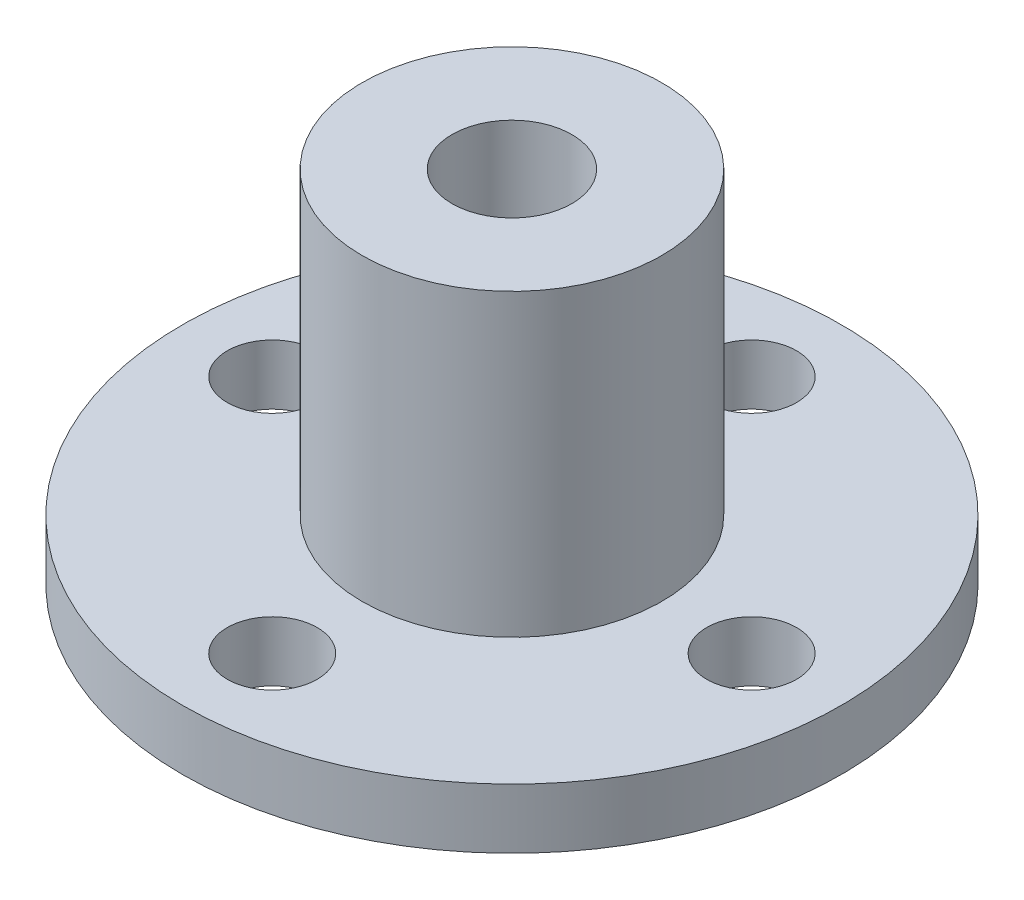
ISO-10303-21;
HEADER;
FILE_DESCRIPTION(('STEP AP214'),'2;1');
FILE_NAME('part.step','',(''),(''),'','','');
FILE_SCHEMA(('AUTOMOTIVE_DESIGN { 1 0 10303 214 1 1 1 1 }'));
ENDSEC;
DATA;
#1=APPLICATION_CONTEXT('core data for automotive mechanical design processes');
#2=APPLICATION_PROTOCOL_DEFINITION('international standard','automotive_design',2000,#1);
#3=PRODUCT_CONTEXT('',#1,'mechanical');
#4=PRODUCT('Part','Part','',(#3));
#5=PRODUCT_RELATED_PRODUCT_CATEGORY('part','',(#4));
#6=PRODUCT_DEFINITION_FORMATION('','',#4);
#7=PRODUCT_DEFINITION_CONTEXT('part definition',#1,'design');
#8=PRODUCT_DEFINITION('design','',#6,#7);
#9=PRODUCT_DEFINITION_SHAPE('','',#8);
#10=(LENGTH_UNIT() NAMED_UNIT(*) SI_UNIT(.MILLI.,.METRE.));
#11=(NAMED_UNIT(*) PLANE_ANGLE_UNIT() SI_UNIT($,.RADIAN.));
#12=(NAMED_UNIT(*) SI_UNIT($,.STERADIAN.) SOLID_ANGLE_UNIT());
#13=UNCERTAINTY_MEASURE_WITH_UNIT(LENGTH_MEASURE(1.E-05),#10,'distance_accuracy_value','');
#14=(GEOMETRIC_REPRESENTATION_CONTEXT(3) GLOBAL_UNCERTAINTY_ASSIGNED_CONTEXT((#13)) GLOBAL_UNIT_ASSIGNED_CONTEXT((#10,
#11,#12)) REPRESENTATION_CONTEXT('',''));
#15=CARTESIAN_POINT('',(0.,0.,0.));
#16=DIRECTION('',(0.,0.,1.));
#17=DIRECTION('',(1.,0.,0.));
#18=AXIS2_PLACEMENT_3D('',#15,#16,#17);
#19=CARTESIAN_POINT('',(0.,2.,0.));
#20=DIRECTION('',(0.,-1.,0.));
#21=DIRECTION('',(0.,0.,-1.));
#22=AXIS2_PLACEMENT_3D('',#19,#20,#21);
#23=CYLINDRICAL_SURFACE('',#22,11.);
#24=CARTESIAN_POINT('',(0.,2.,0.));
#25=DIRECTION('',(0.,1.,0.));
#26=DIRECTION('',(0.,0.,1.));
#27=AXIS2_PLACEMENT_3D('',#24,#25,#26);
#28=CIRCLE('',#27,11.);
#29=CARTESIAN_POINT('',(0.,2.,11.));
#30=VERTEX_POINT('',#29);
#31=EDGE_CURVE('E48',#30,#30,#28,.T.);
#32=ORIENTED_EDGE('',*,*,#31,.F.);
#33=EDGE_LOOP('',(#32));
#34=FACE_BOUND('',#33,.T.);
#35=CARTESIAN_POINT('',(0.,0.,0.));
#36=DIRECTION('',(0.,1.,0.));
#37=DIRECTION('',(0.,0.,1.));
#38=AXIS2_PLACEMENT_3D('',#35,#36,#37);
#39=CIRCLE('',#38,11.);
#40=CARTESIAN_POINT('',(0.,0.,11.));
#41=VERTEX_POINT('',#40);
#42=EDGE_CURVE('E44',#41,#41,#39,.T.);
#43=ORIENTED_EDGE('',*,*,#42,.T.);
#44=EDGE_LOOP('',(#43));
#45=FACE_BOUND('',#44,.T.);
#46=ADVANCED_FACE('F41',(#34,#45),#23,.T.);
#47=CARTESIAN_POINT('',(0.,2.,0.));
#48=DIRECTION('',(0.,1.,0.));
#49=DIRECTION('',(0.,0.,1.));
#50=AXIS2_PLACEMENT_3D('',#47,#48,#49);
#51=PLANE('',#50);
#52=CARTESIAN_POINT('',(0.,2.,-8.));
#53=DIRECTION('',(0.,1.,0.));
#54=DIRECTION('',(-1.,0.,0.));
#55=AXIS2_PLACEMENT_3D('',#52,#53,#54);
#56=CIRCLE('',#55,1.5);
#57=CARTESIAN_POINT('',(-1.49999999999997,2.,-8.00000000000001));
#58=VERTEX_POINT('',#57);
#59=EDGE_CURVE('E82',#58,#58,#56,.T.);
#60=ORIENTED_EDGE('',*,*,#59,.F.);
#61=EDGE_LOOP('',(#60));
#62=FACE_BOUND('',#61,.T.);
#63=CARTESIAN_POINT('',(8.,2.,0.));
#64=DIRECTION('',(0.,1.,0.));
#65=DIRECTION('',(0.,0.,-1.));
#66=AXIS2_PLACEMENT_3D('',#63,#64,#65);
#67=CIRCLE('',#66,1.5);
#68=CARTESIAN_POINT('',(8.,2.,-1.5));
#69=VERTEX_POINT('',#68);
#70=EDGE_CURVE('E76',#69,#69,#67,.T.);
#71=ORIENTED_EDGE('',*,*,#70,.F.);
#72=EDGE_LOOP('',(#71));
#73=FACE_BOUND('',#72,.T.);
#74=CARTESIAN_POINT('',(0.,2.,8.));
#75=DIRECTION('',(0.,1.,0.));
#76=DIRECTION('',(1.,0.,0.));
#77=AXIS2_PLACEMENT_3D('',#74,#75,#76);
#78=CIRCLE('',#77,1.5);
#79=CARTESIAN_POINT('',(1.49999999999992,2.,8.00000000000002));
#80=VERTEX_POINT('',#79);
#81=EDGE_CURVE('E70',#80,#80,#78,.T.);
#82=ORIENTED_EDGE('',*,*,#81,.F.);
#83=EDGE_LOOP('',(#82));
#84=FACE_BOUND('',#83,.T.);
#85=CARTESIAN_POINT('',(-8.,2.,0.));
#86=DIRECTION('',(0.,1.,0.));
#87=DIRECTION('',(0.,0.,1.));
#88=AXIS2_PLACEMENT_3D('',#85,#86,#87);
#89=CIRCLE('',#88,1.5);
#90=CARTESIAN_POINT('',(-8.,2.,1.5));
#91=VERTEX_POINT('',#90);
#92=EDGE_CURVE('E64',#91,#91,#89,.T.);
#93=ORIENTED_EDGE('',*,*,#92,.F.);
#94=EDGE_LOOP('',(#93));
#95=FACE_BOUND('',#94,.T.);
#96=CARTESIAN_POINT('',(0.,2.,0.));
#97=DIRECTION('',(0.,1.,0.));
#98=DIRECTION('',(0.,0.,1.));
#99=AXIS2_PLACEMENT_3D('',#96,#97,#98);
#100=CIRCLE('',#99,5.);
#101=CARTESIAN_POINT('',(0.,2.,5.));
#102=VERTEX_POINT('',#101);
#103=EDGE_CURVE('E10',#102,#102,#100,.T.);
#104=ORIENTED_EDGE('',*,*,#103,.F.);
#105=EDGE_LOOP('',(#104));
#106=FACE_BOUND('',#105,.T.);
#107=ORIENTED_EDGE('',*,*,#31,.T.);
#108=EDGE_LOOP('',(#107));
#109=FACE_BOUND('',#108,.T.);
#110=ADVANCED_FACE('F98',(#62,#73,#84,#95,#106,#109),#51,.T.);
#111=CARTESIAN_POINT('',(0.,0.,0.));
#112=DIRECTION('',(0.,1.,0.));
#113=DIRECTION('',(0.,0.,1.));
#114=AXIS2_PLACEMENT_3D('',#111,#112,#113);
#115=PLANE('',#114);
#116=CARTESIAN_POINT('',(0.,0.,-8.));
#117=DIRECTION('',(0.,1.,0.));
#118=DIRECTION('',(-1.,0.,0.));
#119=AXIS2_PLACEMENT_3D('',#116,#117,#118);
#120=CIRCLE('',#119,1.5);
#121=CARTESIAN_POINT('',(-1.49999999999997,0.,-8.00000000000001));
#122=VERTEX_POINT('',#121);
#123=EDGE_CURVE('E67',#122,#122,#120,.T.);
#124=ORIENTED_EDGE('',*,*,#123,.T.);
#125=EDGE_LOOP('',(#124));
#126=FACE_BOUND('',#125,.T.);
#127=CARTESIAN_POINT('',(8.,0.,0.));
#128=DIRECTION('',(0.,1.,0.));
#129=DIRECTION('',(0.,0.,-1.));
#130=AXIS2_PLACEMENT_3D('',#127,#128,#129);
#131=CIRCLE('',#130,1.5);
#132=CARTESIAN_POINT('',(8.,0.,-1.5));
#133=VERTEX_POINT('',#132);
#134=EDGE_CURVE('E79',#133,#133,#131,.T.);
#135=ORIENTED_EDGE('',*,*,#134,.T.);
#136=EDGE_LOOP('',(#135));
#137=FACE_BOUND('',#136,.T.);
#138=CARTESIAN_POINT('',(0.,0.,8.));
#139=DIRECTION('',(0.,1.,0.));
#140=DIRECTION('',(1.,0.,0.));
#141=AXIS2_PLACEMENT_3D('',#138,#139,#140);
#142=CIRCLE('',#141,1.5);
#143=CARTESIAN_POINT('',(1.49999999999992,0.,8.00000000000002));
#144=VERTEX_POINT('',#143);
#145=EDGE_CURVE('E73',#144,#144,#142,.T.);
#146=ORIENTED_EDGE('',*,*,#145,.T.);
#147=EDGE_LOOP('',(#146));
#148=FACE_BOUND('',#147,.T.);
#149=CARTESIAN_POINT('',(-8.,0.,0.));
#150=DIRECTION('',(0.,1.,0.));
#151=DIRECTION('',(0.,0.,1.));
#152=AXIS2_PLACEMENT_3D('',#149,#150,#151);
#153=CIRCLE('',#152,1.5);
#154=CARTESIAN_POINT('',(-8.,0.,1.5));
#155=VERTEX_POINT('',#154);
#156=EDGE_CURVE('E61',#155,#155,#153,.T.);
#157=ORIENTED_EDGE('',*,*,#156,.T.);
#158=EDGE_LOOP('',(#157));
#159=FACE_BOUND('',#158,.T.);
#160=CARTESIAN_POINT('',(0.,0.,0.));
#161=DIRECTION('',(0.,1.,0.));
#162=DIRECTION('',(0.,0.,1.));
#163=AXIS2_PLACEMENT_3D('',#160,#161,#162);
#164=CIRCLE('',#163,2.);
#165=CARTESIAN_POINT('',(0.,0.,2.));
#166=VERTEX_POINT('',#165);
#167=EDGE_CURVE('E57',#166,#166,#164,.T.);
#168=ORIENTED_EDGE('',*,*,#167,.T.);
#169=EDGE_LOOP('',(#168));
#170=FACE_BOUND('',#169,.T.);
#171=ORIENTED_EDGE('',*,*,#42,.F.);
#172=EDGE_LOOP('',(#171));
#173=FACE_BOUND('',#172,.T.);
#174=ADVANCED_FACE('F88',(#126,#137,#148,#159,#170,#173),#115,.F.);
#175=CARTESIAN_POINT('',(0.,12.,0.));
#176=DIRECTION('',(0.,-1.,0.));
#177=DIRECTION('',(0.,0.,-1.));
#178=AXIS2_PLACEMENT_3D('',#175,#176,#177);
#179=CYLINDRICAL_SURFACE('',#178,5.);
#180=CARTESIAN_POINT('',(0.,12.,0.));
#181=DIRECTION('',(0.,1.,0.));
#182=DIRECTION('',(0.,0.,1.));
#183=AXIS2_PLACEMENT_3D('',#180,#181,#182);
#184=CIRCLE('',#183,5.);
#185=CARTESIAN_POINT('',(0.,12.,5.));
#186=VERTEX_POINT('',#185);
#187=EDGE_CURVE('E54',#186,#186,#184,.T.);
#188=ORIENTED_EDGE('',*,*,#187,.F.);
#189=EDGE_LOOP('',(#188));
#190=FACE_BOUND('',#189,.T.);
#191=ORIENTED_EDGE('',*,*,#103,.T.);
#192=EDGE_LOOP('',(#191));
#193=FACE_BOUND('',#192,.T.);
#194=ADVANCED_FACE('F117',(#190,#193),#179,.T.);
#195=CARTESIAN_POINT('',(0.,12.,0.));
#196=DIRECTION('',(0.,1.,0.));
#197=DIRECTION('',(0.,0.,1.));
#198=AXIS2_PLACEMENT_3D('',#195,#196,#197);
#199=PLANE('',#198);
#200=CARTESIAN_POINT('',(0.,12.,0.));
#201=DIRECTION('',(0.,1.,0.));
#202=DIRECTION('',(0.,0.,1.));
#203=AXIS2_PLACEMENT_3D('',#200,#201,#202);
#204=CIRCLE('',#203,2.);
#205=CARTESIAN_POINT('',(0.,12.,2.));
#206=VERTEX_POINT('',#205);
#207=EDGE_CURVE('E58',#206,#206,#204,.T.);
#208=ORIENTED_EDGE('',*,*,#207,.F.);
#209=EDGE_LOOP('',(#208));
#210=FACE_BOUND('',#209,.T.);
#211=ORIENTED_EDGE('',*,*,#187,.T.);
#212=EDGE_LOOP('',(#211));
#213=FACE_BOUND('',#212,.T.);
#214=ADVANCED_FACE('F121',(#210,#213),#199,.T.);
#215=CARTESIAN_POINT('',(0.,0.,0.));
#216=DIRECTION('',(0.,1.,0.));
#217=DIRECTION('',(0.,0.,1.));
#218=AXIS2_PLACEMENT_3D('',#215,#216,#217);
#219=CYLINDRICAL_SURFACE('',#218,2.);
#220=ORIENTED_EDGE('',*,*,#167,.F.);
#221=EDGE_LOOP('',(#220));
#222=FACE_BOUND('',#221,.T.);
#223=ORIENTED_EDGE('',*,*,#207,.T.);
#224=EDGE_LOOP('',(#223));
#225=FACE_BOUND('',#224,.T.);
#226=ADVANCED_FACE('F127',(#222,#225),#219,.F.);
#227=CARTESIAN_POINT('',(-8.,0.,0.));
#228=DIRECTION('',(0.,1.,0.));
#229=DIRECTION('',(0.,0.,1.));
#230=AXIS2_PLACEMENT_3D('',#227,#228,#229);
#231=CYLINDRICAL_SURFACE('',#230,1.5);
#232=ORIENTED_EDGE('',*,*,#156,.F.);
#233=EDGE_LOOP('',(#232));
#234=FACE_BOUND('',#233,.T.);
#235=ORIENTED_EDGE('',*,*,#92,.T.);
#236=EDGE_LOOP('',(#235));
#237=FACE_BOUND('',#236,.T.);
#238=ADVANCED_FACE('F131',(#234,#237),#231,.F.);
#239=CARTESIAN_POINT('',(0.,0.,8.));
#240=DIRECTION('',(0.,1.,0.));
#241=DIRECTION('',(0.,0.,1.));
#242=AXIS2_PLACEMENT_3D('',#239,#240,#241);
#243=CYLINDRICAL_SURFACE('',#242,1.5);
#244=ORIENTED_EDGE('',*,*,#145,.F.);
#245=EDGE_LOOP('',(#244));
#246=FACE_BOUND('',#245,.T.);
#247=ORIENTED_EDGE('',*,*,#81,.T.);
#248=EDGE_LOOP('',(#247));
#249=FACE_BOUND('',#248,.T.);
#250=ADVANCED_FACE('F135',(#246,#249),#243,.F.);
#251=CARTESIAN_POINT('',(8.,0.,0.));
#252=DIRECTION('',(0.,1.,0.));
#253=DIRECTION('',(0.,0.,1.));
#254=AXIS2_PLACEMENT_3D('',#251,#252,#253);
#255=CYLINDRICAL_SURFACE('',#254,1.5);
#256=ORIENTED_EDGE('',*,*,#134,.F.);
#257=EDGE_LOOP('',(#256));
#258=FACE_BOUND('',#257,.T.);
#259=ORIENTED_EDGE('',*,*,#70,.T.);
#260=EDGE_LOOP('',(#259));
#261=FACE_BOUND('',#260,.T.);
#262=ADVANCED_FACE('F94',(#258,#261),#255,.F.);
#263=CARTESIAN_POINT('',(0.,0.,-8.));
#264=DIRECTION('',(0.,1.,0.));
#265=DIRECTION('',(0.,0.,1.));
#266=AXIS2_PLACEMENT_3D('',#263,#264,#265);
#267=CYLINDRICAL_SURFACE('',#266,1.5);
#268=ORIENTED_EDGE('',*,*,#123,.F.);
#269=EDGE_LOOP('',(#268));
#270=FACE_BOUND('',#269,.T.);
#271=ORIENTED_EDGE('',*,*,#59,.T.);
#272=EDGE_LOOP('',(#271));
#273=FACE_BOUND('',#272,.T.);
#274=ADVANCED_FACE('F91',(#270,#273),#267,.F.);
#275=CLOSED_SHELL('',(#46,#110,#174,#194,#214,#226,#238,#250,#262,#274));
#276=MANIFOLD_SOLID_BREP('B2',#275);
#277=ADVANCED_BREP_SHAPE_REPRESENTATION('',(#18,#276),#14);
#278=SHAPE_DEFINITION_REPRESENTATION(#9,#277);
ENDSEC;
END-ISO-10303-21;
